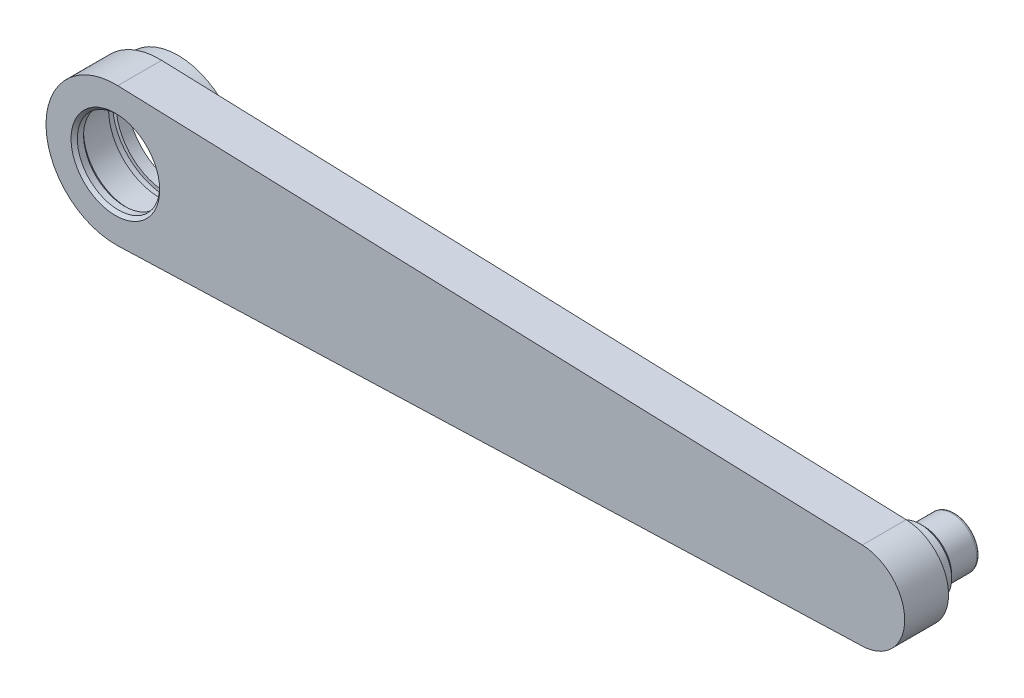
ISO-10303-21;
HEADER;
FILE_DESCRIPTION(('STEP AP214'),'2;1');
FILE_NAME('part.step','',(''),(''),'','','');
FILE_SCHEMA(('AUTOMOTIVE_DESIGN { 1 0 10303 214 1 1 1 1 }'));
ENDSEC;
DATA;
#1=APPLICATION_CONTEXT('core data for automotive mechanical design processes');
#2=APPLICATION_PROTOCOL_DEFINITION('international standard','automotive_design',2000,#1);
#3=PRODUCT_CONTEXT('',#1,'mechanical');
#4=PRODUCT('Part','Part','',(#3));
#5=PRODUCT_RELATED_PRODUCT_CATEGORY('part','',(#4));
#6=PRODUCT_DEFINITION_FORMATION('','',#4);
#7=PRODUCT_DEFINITION_CONTEXT('part definition',#1,'design');
#8=PRODUCT_DEFINITION('design','',#6,#7);
#9=PRODUCT_DEFINITION_SHAPE('','',#8);
#10=(LENGTH_UNIT() NAMED_UNIT(*) SI_UNIT(.MILLI.,.METRE.));
#11=(NAMED_UNIT(*) PLANE_ANGLE_UNIT() SI_UNIT($,.RADIAN.));
#12=(NAMED_UNIT(*) SI_UNIT($,.STERADIAN.) SOLID_ANGLE_UNIT());
#13=UNCERTAINTY_MEASURE_WITH_UNIT(LENGTH_MEASURE(1.E-05),#10,'distance_accuracy_value','');
#14=(GEOMETRIC_REPRESENTATION_CONTEXT(3) GLOBAL_UNCERTAINTY_ASSIGNED_CONTEXT((#13)) GLOBAL_UNIT_ASSIGNED_CONTEXT((#10,
#11,#12)) REPRESENTATION_CONTEXT('',''));
#15=CARTESIAN_POINT('',(0.,0.,0.));
#16=DIRECTION('',(0.,0.,1.));
#17=DIRECTION('',(1.,0.,0.));
#18=AXIS2_PLACEMENT_3D('',#15,#16,#17);
#19=CARTESIAN_POINT('',(0.,0.,7.));
#20=DIRECTION('',(0.,0.,-1.));
#21=DIRECTION('',(-1.,0.,0.));
#22=AXIS2_PLACEMENT_3D('',#19,#20,#21);
#23=CYLINDRICAL_SURFACE('',#22,8.075);
#24=CARTESIAN_POINT('',(0.,0.,-3.));
#25=DIRECTION('',(0.,0.,-1.));
#26=DIRECTION('',(-1.,0.,0.));
#27=AXIS2_PLACEMENT_3D('',#24,#25,#26);
#28=CIRCLE('',#27,8.075);
#29=CARTESIAN_POINT('',(-8.075,0.,-3.));
#30=VERTEX_POINT('',#29);
#31=EDGE_CURVE('E158',#30,#30,#28,.T.);
#32=ORIENTED_EDGE('',*,*,#31,.T.);
#33=EDGE_LOOP('',(#32));
#34=FACE_BOUND('',#33,.T.);
#35=CARTESIAN_POINT('',(0.,0.,-1.2));
#36=DIRECTION('',(0.,0.,1.));
#37=DIRECTION('',(1.,0.,0.));
#38=AXIS2_PLACEMENT_3D('',#35,#36,#37);
#39=CIRCLE('',#38,8.075);
#40=CARTESIAN_POINT('',(8.075,0.,-1.2));
#41=VERTEX_POINT('',#40);
#42=EDGE_CURVE('E51',#41,#41,#39,.T.);
#43=ORIENTED_EDGE('',*,*,#42,.T.);
#44=EDGE_LOOP('',(#43));
#45=FACE_BOUND('',#44,.T.);
#46=ADVANCED_FACE('F50',(#34,#45),#23,.F.);
#47=CARTESIAN_POINT('',(0.,0.,0.));
#48=DIRECTION('',(0.,0.,1.));
#49=DIRECTION('',(1.,0.,0.));
#50=AXIS2_PLACEMENT_3D('',#47,#48,#49);
#51=PLANE('',#50);
#52=DIRECTION('',(0.99941232754524,0.0342782664469186,0.));
#53=VECTOR('',#52,1.);
#54=CARTESIAN_POINT('',(0.379631800899624,-11.0684915275635,0.));
#55=LINE('',#54,#53);
#56=CARTESIAN_POINT('',(0.379631800899624,-11.0684915275635,0.));
#57=VERTEX_POINT('',#56);
#58=CARTESIAN_POINT('',(119.,-7.00000000000001,0.));
#59=VERTEX_POINT('',#58);
#60=EDGE_CURVE('E116',#57,#59,#55,.T.);
#61=ORIENTED_EDGE('',*,*,#60,.F.);
#62=CARTESIAN_POINT('',(0.,0.,0.));
#63=DIRECTION('',(0.,0.,1.));
#64=DIRECTION('',(1.,0.,0.));
#65=AXIS2_PLACEMENT_3D('',#62,#63,#64);
#66=CIRCLE('',#65,11.075);
#67=CARTESIAN_POINT('',(0.379248949579832,11.0685046521309,0.));
#68=VERTEX_POINT('',#67);
#69=EDGE_CURVE('E82',#68,#57,#66,.T.);
#70=ORIENTED_EDGE('',*,*,#69,.F.);
#71=DIRECTION('',(0.999413512607753,-0.0342436974789916,0.));
#72=VECTOR('',#71,1.);
#73=CARTESIAN_POINT('',(0.379248949579832,11.0685046521309,0.));
#74=LINE('',#73,#72);
#75=CARTESIAN_POINT('',(119.239705882353,6.99589458825428,0.));
#76=VERTEX_POINT('',#75);
#77=EDGE_CURVE('E122',#68,#76,#74,.T.);
#78=ORIENTED_EDGE('',*,*,#77,.T.);
#79=CARTESIAN_POINT('',(119.,0.,0.));
#80=DIRECTION('',(0.,0.,1.));
#81=DIRECTION('',(1.,0.,0.));
#82=AXIS2_PLACEMENT_3D('',#79,#80,#81);
#83=CIRCLE('',#82,7.00000000000001);
#84=EDGE_CURVE('E104',#59,#76,#83,.T.);
#85=ORIENTED_EDGE('',*,*,#84,.F.);
#86=EDGE_LOOP('',(#61,#70,#78,#85));
#87=FACE_BOUND('',#86,.T.);
#88=CARTESIAN_POINT('',(119.,0.,0.));
#89=DIRECTION('',(0.,0.,1.));
#90=DIRECTION('',(1.,0.,0.));
#91=AXIS2_PLACEMENT_3D('',#88,#89,#90);
#92=CIRCLE('',#91,5.);
#93=CARTESIAN_POINT('',(124.,0.,0.));
#94=VERTEX_POINT('',#93);
#95=EDGE_CURVE('E130',#94,#94,#92,.F.);
#96=ORIENTED_EDGE('',*,*,#95,.F.);
#97=EDGE_LOOP('',(#96));
#98=FACE_BOUND('',#97,.T.);
#99=CARTESIAN_POINT('',(0.,0.,0.));
#100=DIRECTION('',(0.,0.,1.));
#101=DIRECTION('',(1.,0.,0.));
#102=AXIS2_PLACEMENT_3D('',#99,#100,#101);
#103=CIRCLE('',#102,10.075);
#104=CARTESIAN_POINT('',(10.075,0.,0.));
#105=VERTEX_POINT('',#104);
#106=EDGE_CURVE('E11',#105,#105,#103,.F.);
#107=ORIENTED_EDGE('',*,*,#106,.F.);
#108=EDGE_LOOP('',(#107));
#109=FACE_BOUND('',#108,.T.);
#110=ADVANCED_FACE('F203',(#87,#98,#109),#51,.F.);
#111=CARTESIAN_POINT('',(119.,0.,-10.));
#112=DIRECTION('',(0.,0.,1.));
#113=DIRECTION('',(1.,0.,0.));
#114=AXIS2_PLACEMENT_3D('',#111,#112,#113);
#115=CYLINDRICAL_SURFACE('',#114,4.00000000000001);
#116=CARTESIAN_POINT('',(119.,0.,-7.5));
#117=DIRECTION('',(0.,0.,-1.));
#118=DIRECTION('',(-1.,0.,0.));
#119=AXIS2_PLACEMENT_3D('',#116,#117,#118);
#120=CIRCLE('',#119,4.00000000000001);
#121=CARTESIAN_POINT('',(115.,0.,-7.5));
#122=VERTEX_POINT('',#121);
#123=EDGE_CURVE('E60',#122,#122,#120,.F.);
#124=ORIENTED_EDGE('',*,*,#123,.T.);
#125=EDGE_LOOP('',(#124));
#126=FACE_BOUND('',#125,.T.);
#127=CARTESIAN_POINT('',(119.,0.,-3.));
#128=DIRECTION('',(0.,0.,-1.));
#129=DIRECTION('',(-1.,0.,0.));
#130=AXIS2_PLACEMENT_3D('',#127,#128,#129);
#131=CIRCLE('',#130,4.00000000000001);
#132=CARTESIAN_POINT('',(115.,0.,-3.));
#133=VERTEX_POINT('',#132);
#134=EDGE_CURVE('E176',#133,#133,#131,.T.);
#135=ORIENTED_EDGE('',*,*,#134,.T.);
#136=EDGE_LOOP('',(#135));
#137=FACE_BOUND('',#136,.T.);
#138=ADVANCED_FACE('F213',(#126,#137),#115,.T.);
#139=CARTESIAN_POINT('',(0.,0.,0.));
#140=DIRECTION('',(0.,0.,1.));
#141=DIRECTION('',(1.,0.,0.));
#142=AXIS2_PLACEMENT_3D('',#139,#140,#141);
#143=CIRCLE('',#142,8.075);
#144=CARTESIAN_POINT('',(8.075,0.,0.));
#145=VERTEX_POINT('',#144);
#146=EDGE_CURVE('E155',#145,#145,#143,.T.);
#147=ORIENTED_EDGE('',*,*,#146,.F.);
#148=EDGE_LOOP('',(#147));
#149=FACE_BOUND('',#148,.T.);
#150=CARTESIAN_POINT('',(0.,0.,5.));
#151=DIRECTION('',(0.,0.,1.));
#152=DIRECTION('',(1.,0.,0.));
#153=AXIS2_PLACEMENT_3D('',#150,#151,#152);
#154=CIRCLE('',#153,8.075);
#155=CARTESIAN_POINT('',(8.075,0.,5.));
#156=VERTEX_POINT('',#155);
#157=EDGE_CURVE('E118',#156,#156,#154,.T.);
#158=ORIENTED_EDGE('',*,*,#157,.T.);
#159=EDGE_LOOP('',(#158));
#160=FACE_BOUND('',#159,.T.);
#161=ADVANCED_FACE('F183',(#149,#160),#23,.F.);
#162=CARTESIAN_POINT('',(0.379631800899624,-11.0684915275635,7.));
#163=DIRECTION('',(-0.0342782664469186,0.99941232754524,0.));
#164=DIRECTION('',(-0.99941232754524,-0.0342782664469186,0.));
#165=AXIS2_PLACEMENT_3D('',#162,#163,#164);
#166=PLANE('',#165);
#167=ORIENTED_EDGE('',*,*,#60,.T.);
#168=DIRECTION('',(0.,0.,-1.));
#169=VECTOR('',#168,1.);
#170=CARTESIAN_POINT('',(119.,-7.00000000000001,7.));
#171=LINE('',#170,#169);
#172=CARTESIAN_POINT('',(119.,-7.00000000000001,7.));
#173=VERTEX_POINT('',#172);
#174=EDGE_CURVE('E108',#173,#59,#171,.T.);
#175=ORIENTED_EDGE('',*,*,#174,.F.);
#176=DIRECTION('',(0.99941232754524,0.0342782664469186,0.));
#177=VECTOR('',#176,1.);
#178=CARTESIAN_POINT('',(0.379631800899624,-11.0684915275635,7.));
#179=LINE('',#178,#177);
#180=CARTESIAN_POINT('',(0.379631800899624,-11.0684915275635,7.));
#181=VERTEX_POINT('',#180);
#182=EDGE_CURVE('E96',#181,#173,#179,.T.);
#183=ORIENTED_EDGE('',*,*,#182,.F.);
#184=DIRECTION('',(0.,0.,-1.));
#185=VECTOR('',#184,1.);
#186=CARTESIAN_POINT('',(0.379631800899624,-11.0684915275635,7.));
#187=LINE('',#186,#185);
#188=EDGE_CURVE('E115',#181,#57,#187,.T.);
#189=ORIENTED_EDGE('',*,*,#188,.T.);
#190=EDGE_LOOP('',(#167,#175,#183,#189));
#191=FACE_BOUND('',#190,.T.);
#192=ADVANCED_FACE('F218',(#191),#166,.F.);
#193=CARTESIAN_POINT('',(119.,0.,7.));
#194=DIRECTION('',(0.,0.,-1.));
#195=DIRECTION('',(-1.,0.,0.));
#196=AXIS2_PLACEMENT_3D('',#193,#194,#195);
#197=CYLINDRICAL_SURFACE('',#196,7.00000000000001);
#198=ORIENTED_EDGE('',*,*,#84,.T.);
#199=DIRECTION('',(0.,0.,-1.));
#200=VECTOR('',#199,1.);
#201=CARTESIAN_POINT('',(119.239705882353,6.99589458825428,7.));
#202=LINE('',#201,#200);
#203=CARTESIAN_POINT('',(119.239705882353,6.99589458825428,7.));
#204=VERTEX_POINT('',#203);
#205=EDGE_CURVE('E105',#204,#76,#202,.T.);
#206=ORIENTED_EDGE('',*,*,#205,.F.);
#207=CARTESIAN_POINT('',(119.,0.,7.));
#208=DIRECTION('',(0.,0.,1.));
#209=DIRECTION('',(1.,0.,0.));
#210=AXIS2_PLACEMENT_3D('',#207,#208,#209);
#211=CIRCLE('',#210,7.00000000000001);
#212=EDGE_CURVE('E93',#173,#204,#211,.T.);
#213=ORIENTED_EDGE('',*,*,#212,.F.);
#214=ORIENTED_EDGE('',*,*,#174,.T.);
#215=EDGE_LOOP('',(#198,#206,#213,#214));
#216=FACE_BOUND('',#215,.T.);
#217=ADVANCED_FACE('F101',(#216),#197,.T.);
#218=CARTESIAN_POINT('',(0.379248949579832,11.0685046521309,7.));
#219=DIRECTION('',(0.0342436974789916,0.999413512607753,0.));
#220=DIRECTION('',(-0.999413512607753,0.0342436974789916,0.));
#221=AXIS2_PLACEMENT_3D('',#218,#219,#220);
#222=PLANE('',#221);
#223=ORIENTED_EDGE('',*,*,#77,.F.);
#224=DIRECTION('',(0.,0.,-1.));
#225=VECTOR('',#224,1.);
#226=CARTESIAN_POINT('',(0.379248949579832,11.0685046521309,7.));
#227=LINE('',#226,#225);
#228=CARTESIAN_POINT('',(0.379248949579832,11.0685046521309,7.));
#229=VERTEX_POINT('',#228);
#230=EDGE_CURVE('E85',#229,#68,#227,.T.);
#231=ORIENTED_EDGE('',*,*,#230,.F.);
#232=DIRECTION('',(0.999413512607753,-0.0342436974789916,0.));
#233=VECTOR('',#232,1.);
#234=CARTESIAN_POINT('',(0.379248949579832,11.0685046521309,7.));
#235=LINE('',#234,#233);
#236=EDGE_CURVE('E98',#229,#204,#235,.T.);
#237=ORIENTED_EDGE('',*,*,#236,.T.);
#238=ORIENTED_EDGE('',*,*,#205,.T.);
#239=EDGE_LOOP('',(#223,#231,#237,#238));
#240=FACE_BOUND('',#239,.T.);
#241=ADVANCED_FACE('F109',(#240),#222,.T.);
#242=CARTESIAN_POINT('',(0.,0.,7.));
#243=DIRECTION('',(0.,0.,-1.));
#244=DIRECTION('',(-1.,0.,0.));
#245=AXIS2_PLACEMENT_3D('',#242,#243,#244);
#246=CYLINDRICAL_SURFACE('',#245,11.075);
#247=ORIENTED_EDGE('',*,*,#69,.T.);
#248=ORIENTED_EDGE('',*,*,#188,.F.);
#249=CARTESIAN_POINT('',(0.,0.,7.));
#250=DIRECTION('',(0.,0.,1.));
#251=DIRECTION('',(1.,0.,0.));
#252=AXIS2_PLACEMENT_3D('',#249,#250,#251);
#253=CIRCLE('',#252,11.075);
#254=EDGE_CURVE('E68',#229,#181,#253,.T.);
#255=ORIENTED_EDGE('',*,*,#254,.F.);
#256=ORIENTED_EDGE('',*,*,#230,.T.);
#257=EDGE_LOOP('',(#247,#248,#255,#256));
#258=FACE_BOUND('',#257,.T.);
#259=ADVANCED_FACE('F197',(#258),#246,.T.);
#260=CARTESIAN_POINT('',(0.,0.,7.));
#261=DIRECTION('',(0.,0.,1.));
#262=DIRECTION('',(1.,0.,0.));
#263=AXIS2_PLACEMENT_3D('',#260,#261,#262);
#264=PLANE('',#263);
#265=CARTESIAN_POINT('',(0.,0.,7.));
#266=DIRECTION('',(0.,0.,1.));
#267=DIRECTION('',(1.,0.,0.));
#268=AXIS2_PLACEMENT_3D('',#265,#266,#267);
#269=CIRCLE('',#268,7.07500000000001);
#270=CARTESIAN_POINT('',(7.07500000000001,0.,7.));
#271=VERTEX_POINT('',#270);
#272=EDGE_CURVE('E137',#271,#271,#269,.F.);
#273=ORIENTED_EDGE('',*,*,#272,.T.);
#274=EDGE_LOOP('',(#273));
#275=FACE_BOUND('',#274,.T.);
#276=ORIENTED_EDGE('',*,*,#182,.T.);
#277=ORIENTED_EDGE('',*,*,#212,.T.);
#278=ORIENTED_EDGE('',*,*,#236,.F.);
#279=ORIENTED_EDGE('',*,*,#254,.T.);
#280=EDGE_LOOP('',(#276,#277,#278,#279));
#281=FACE_BOUND('',#280,.T.);
#282=ADVANCED_FACE('F94',(#275,#281),#264,.T.);
#283=CARTESIAN_POINT('',(0.,0.,5.));
#284=DIRECTION('',(0.,0.,1.));
#285=DIRECTION('',(1.,0.,0.));
#286=AXIS2_PLACEMENT_3D('',#283,#284,#285);
#287=PLANE('',#286);
#288=CARTESIAN_POINT('',(0.,0.,5.));
#289=DIRECTION('',(0.,0.,1.));
#290=DIRECTION('',(1.,0.,0.));
#291=AXIS2_PLACEMENT_3D('',#288,#289,#290);
#292=CIRCLE('',#291,7.07500000000001);
#293=CARTESIAN_POINT('',(7.07500000000001,0.,5.));
#294=VERTEX_POINT('',#293);
#295=EDGE_CURVE('E139',#294,#294,#292,.T.);
#296=ORIENTED_EDGE('',*,*,#295,.T.);
#297=EDGE_LOOP('',(#296));
#298=FACE_BOUND('',#297,.T.);
#299=ORIENTED_EDGE('',*,*,#157,.F.);
#300=EDGE_LOOP('',(#299));
#301=FACE_BOUND('',#300,.T.);
#302=ADVANCED_FACE('F187',(#298,#301),#287,.F.);
#303=CARTESIAN_POINT('',(0.,0.,5.));
#304=DIRECTION('',(0.,0.,1.));
#305=DIRECTION('',(1.,0.,0.));
#306=AXIS2_PLACEMENT_3D('',#303,#304,#305);
#307=CYLINDRICAL_SURFACE('',#306,6.575);
#308=CARTESIAN_POINT('',(0.,0.,6.49999999999998));
#309=DIRECTION('',(0.,0.,1.));
#310=DIRECTION('',(1.,0.,0.));
#311=AXIS2_PLACEMENT_3D('',#308,#309,#310);
#312=CIRCLE('',#311,6.575);
#313=CARTESIAN_POINT('',(6.575,0.,6.49999999999998));
#314=VERTEX_POINT('',#313);
#315=EDGE_CURVE('E131',#314,#314,#312,.T.);
#316=ORIENTED_EDGE('',*,*,#315,.T.);
#317=EDGE_LOOP('',(#316));
#318=FACE_BOUND('',#317,.T.);
#319=CARTESIAN_POINT('',(0.,0.,5.50000000000002));
#320=DIRECTION('',(0.,0.,1.));
#321=DIRECTION('',(1.,0.,0.));
#322=AXIS2_PLACEMENT_3D('',#319,#320,#321);
#323=CIRCLE('',#322,6.575);
#324=CARTESIAN_POINT('',(6.575,0.,5.50000000000002));
#325=VERTEX_POINT('',#324);
#326=EDGE_CURVE('E127',#325,#325,#323,.F.);
#327=ORIENTED_EDGE('',*,*,#326,.T.);
#328=EDGE_LOOP('',(#327));
#329=FACE_BOUND('',#328,.T.);
#330=ADVANCED_FACE('F189',(#318,#329),#307,.F.);
#331=CARTESIAN_POINT('',(119.,0.,-3.));
#332=DIRECTION('',(0.,0.,-1.));
#333=DIRECTION('',(-1.,0.,0.));
#334=AXIS2_PLACEMENT_3D('',#331,#332,#333);
#335=PLANE('',#334);
#336=CARTESIAN_POINT('',(119.,0.,-3.));
#337=DIRECTION('',(0.,0.,-1.));
#338=DIRECTION('',(-1.,0.,0.));
#339=AXIS2_PLACEMENT_3D('',#336,#337,#338);
#340=CIRCLE('',#339,4.5);
#341=CARTESIAN_POINT('',(114.5,0.,-3.));
#342=VERTEX_POINT('',#341);
#343=EDGE_CURVE('E145',#342,#342,#340,.T.);
#344=ORIENTED_EDGE('',*,*,#343,.T.);
#345=EDGE_LOOP('',(#344));
#346=FACE_BOUND('',#345,.T.);
#347=ORIENTED_EDGE('',*,*,#134,.F.);
#348=EDGE_LOOP('',(#347));
#349=FACE_BOUND('',#348,.T.);
#350=ADVANCED_FACE('F192',(#346,#349),#335,.T.);
#351=CARTESIAN_POINT('',(119.,0.,-3.));
#352=DIRECTION('',(0.,0.,1.));
#353=DIRECTION('',(1.,0.,0.));
#354=AXIS2_PLACEMENT_3D('',#351,#352,#353);
#355=CYLINDRICAL_SURFACE('',#354,5.);
#356=CARTESIAN_POINT('',(119.,0.,-2.50000000000002));
#357=DIRECTION('',(0.,0.,-1.));
#358=DIRECTION('',(-1.,0.,0.));
#359=AXIS2_PLACEMENT_3D('',#356,#357,#358);
#360=CIRCLE('',#359,5.);
#361=CARTESIAN_POINT('',(114.,0.,-2.50000000000002));
#362=VERTEX_POINT('',#361);
#363=EDGE_CURVE('E143',#362,#362,#360,.F.);
#364=ORIENTED_EDGE('',*,*,#363,.T.);
#365=EDGE_LOOP('',(#364));
#366=FACE_BOUND('',#365,.T.);
#367=ORIENTED_EDGE('',*,*,#95,.T.);
#368=EDGE_LOOP('',(#367));
#369=FACE_BOUND('',#368,.T.);
#370=ADVANCED_FACE('F231',(#366,#369),#355,.T.);
#371=CARTESIAN_POINT('',(0.,0.,6.49999999999998));
#372=DIRECTION('',(0.,0.,1.));
#373=DIRECTION('',(1.,0.,0.));
#374=AXIS2_PLACEMENT_3D('',#371,#372,#373);
#375=CONICAL_SURFACE('',#374,6.575,0.78539816339744);
#376=ORIENTED_EDGE('',*,*,#272,.F.);
#377=EDGE_LOOP('',(#376));
#378=FACE_BOUND('',#377,.T.);
#379=ORIENTED_EDGE('',*,*,#315,.F.);
#380=EDGE_LOOP('',(#379));
#381=FACE_BOUND('',#380,.T.);
#382=ADVANCED_FACE('F236',(#378,#381),#375,.F.);
#383=CARTESIAN_POINT('',(0.,0.,5.));
#384=DIRECTION('',(0.,0.,-1.));
#385=DIRECTION('',(-1.,0.,0.));
#386=AXIS2_PLACEMENT_3D('',#383,#384,#385);
#387=CONICAL_SURFACE('',#386,7.07500000000001,0.785398163397444);
#388=ORIENTED_EDGE('',*,*,#326,.F.);
#389=EDGE_LOOP('',(#388));
#390=FACE_BOUND('',#389,.T.);
#391=ORIENTED_EDGE('',*,*,#295,.F.);
#392=EDGE_LOOP('',(#391));
#393=FACE_BOUND('',#392,.T.);
#394=ADVANCED_FACE('F360',(#390,#393),#387,.F.);
#395=CARTESIAN_POINT('',(119.,0.,-3.));
#396=DIRECTION('',(0.,0.,1.));
#397=DIRECTION('',(1.,0.,0.));
#398=AXIS2_PLACEMENT_3D('',#395,#396,#397);
#399=CONICAL_SURFACE('',#398,4.5,0.785398163397466);
#400=ORIENTED_EDGE('',*,*,#363,.F.);
#401=EDGE_LOOP('',(#400));
#402=FACE_BOUND('',#401,.T.);
#403=ORIENTED_EDGE('',*,*,#343,.F.);
#404=EDGE_LOOP('',(#403));
#405=FACE_BOUND('',#404,.T.);
#406=ADVANCED_FACE('F242',(#402,#405),#399,.T.);
#407=CARTESIAN_POINT('',(119.,0.,-8.));
#408=DIRECTION('',(0.,0.,-1.));
#409=DIRECTION('',(-1.,0.,0.));
#410=AXIS2_PLACEMENT_3D('',#407,#408,#409);
#411=PLANE('',#410);
#412=CARTESIAN_POINT('',(119.,0.,-8.));
#413=DIRECTION('',(0.,0.,-1.));
#414=DIRECTION('',(-1.,0.,0.));
#415=AXIS2_PLACEMENT_3D('',#412,#413,#414);
#416=CIRCLE('',#415,2.2);
#417=CARTESIAN_POINT('',(116.8,0.,-8.));
#418=VERTEX_POINT('',#417);
#419=EDGE_CURVE('E175',#418,#418,#416,.T.);
#420=ORIENTED_EDGE('',*,*,#419,.F.);
#421=EDGE_LOOP('',(#420));
#422=FACE_BOUND('',#421,.T.);
#423=CARTESIAN_POINT('',(119.,0.,-8.));
#424=DIRECTION('',(0.,0.,-1.));
#425=DIRECTION('',(-1.,0.,0.));
#426=AXIS2_PLACEMENT_3D('',#423,#424,#425);
#427=CIRCLE('',#426,3.50000000000001);
#428=CARTESIAN_POINT('',(115.5,0.,-8.));
#429=VERTEX_POINT('',#428);
#430=EDGE_CURVE('E146',#429,#429,#427,.T.);
#431=ORIENTED_EDGE('',*,*,#430,.T.);
#432=EDGE_LOOP('',(#431));
#433=FACE_BOUND('',#432,.T.);
#434=ADVANCED_FACE('F241',(#422,#433),#411,.T.);
#435=CARTESIAN_POINT('',(119.,0.,-7.5));
#436=DIRECTION('',(0.,0.,-1.));
#437=DIRECTION('',(-1.,0.,0.));
#438=AXIS2_PLACEMENT_3D('',#435,#436,#437);
#439=TOROIDAL_SURFACE('',#438,3.50000000000001,0.5);
#440=ORIENTED_EDGE('',*,*,#123,.F.);
#441=EDGE_LOOP('',(#440));
#442=FACE_BOUND('',#441,.T.);
#443=ORIENTED_EDGE('',*,*,#430,.F.);
#444=EDGE_LOOP('',(#443));
#445=FACE_BOUND('',#444,.T.);
#446=ADVANCED_FACE('F47',(#442,#445),#439,.T.);
#447=CARTESIAN_POINT('',(119.,0.,2.));
#448=DIRECTION('',(0.,0.,-1.));
#449=DIRECTION('',(-1.,0.,0.));
#450=AXIS2_PLACEMENT_3D('',#447,#448,#449);
#451=CYLINDRICAL_SURFACE('',#450,2.2);
#452=CARTESIAN_POINT('',(119.,0.,2.));
#453=DIRECTION('',(0.,0.,-1.));
#454=DIRECTION('',(-1.,0.,0.));
#455=AXIS2_PLACEMENT_3D('',#452,#453,#454);
#456=CIRCLE('',#455,2.2);
#457=CARTESIAN_POINT('',(116.8,0.,2.));
#458=VERTEX_POINT('',#457);
#459=EDGE_CURVE('E173',#458,#458,#456,.T.);
#460=ORIENTED_EDGE('',*,*,#459,.F.);
#461=EDGE_LOOP('',(#460));
#462=FACE_BOUND('',#461,.T.);
#463=ORIENTED_EDGE('',*,*,#419,.T.);
#464=EDGE_LOOP('',(#463));
#465=FACE_BOUND('',#464,.T.);
#466=ADVANCED_FACE('F246',(#462,#465),#451,.F.);
#467=CARTESIAN_POINT('',(119.,0.,2.));
#468=DIRECTION('',(0.,0.,-1.));
#469=DIRECTION('',(-1.,0.,0.));
#470=AXIS2_PLACEMENT_3D('',#467,#468,#469);
#471=PLANE('',#470);
#472=ORIENTED_EDGE('',*,*,#459,.T.);
#473=EDGE_LOOP('',(#472));
#474=FACE_BOUND('',#473,.T.);
#475=ADVANCED_FACE('F248',(#474),#471,.T.);
#476=CARTESIAN_POINT('',(0.,0.,-3.));
#477=DIRECTION('',(0.,0.,-1.));
#478=DIRECTION('',(-1.,0.,0.));
#479=AXIS2_PLACEMENT_3D('',#476,#477,#478);
#480=PLANE('',#479);
#481=CARTESIAN_POINT('',(0.,0.,-3.));
#482=DIRECTION('',(0.,0.,-1.));
#483=DIRECTION('',(-1.,0.,0.));
#484=AXIS2_PLACEMENT_3D('',#481,#482,#483);
#485=CIRCLE('',#484,10.075);
#486=CARTESIAN_POINT('',(-10.075,0.,-3.));
#487=VERTEX_POINT('',#486);
#488=EDGE_CURVE('E169',#487,#487,#485,.T.);
#489=ORIENTED_EDGE('',*,*,#488,.T.);
#490=EDGE_LOOP('',(#489));
#491=FACE_BOUND('',#490,.T.);
#492=ORIENTED_EDGE('',*,*,#31,.F.);
#493=EDGE_LOOP('',(#492));
#494=FACE_BOUND('',#493,.T.);
#495=ADVANCED_FACE('F254',(#491,#494),#480,.T.);
#496=CARTESIAN_POINT('',(0.,0.,-3.));
#497=DIRECTION('',(0.,0.,1.));
#498=DIRECTION('',(1.,0.,0.));
#499=AXIS2_PLACEMENT_3D('',#496,#497,#498);
#500=CYLINDRICAL_SURFACE('',#499,10.075);
#501=ORIENTED_EDGE('',*,*,#488,.F.);
#502=EDGE_LOOP('',(#501));
#503=FACE_BOUND('',#502,.T.);
#504=ORIENTED_EDGE('',*,*,#106,.T.);
#505=EDGE_LOOP('',(#504));
#506=FACE_BOUND('',#505,.T.);
#507=ADVANCED_FACE('F253',(#503,#506),#500,.T.);
#508=CARTESIAN_POINT('',(0.,0.,0.));
#509=DIRECTION('',(0.,0.,1.));
#510=DIRECTION('',(1.,0.,0.));
#511=AXIS2_PLACEMENT_3D('',#508,#509,#510);
#512=CYLINDRICAL_SURFACE('',#511,8.65);
#513=CARTESIAN_POINT('',(0.,0.,0.));
#514=DIRECTION('',(0.,0.,1.));
#515=DIRECTION('',(1.,0.,0.));
#516=AXIS2_PLACEMENT_3D('',#513,#514,#515);
#517=CIRCLE('',#516,8.65);
#518=CARTESIAN_POINT('',(8.65,0.,0.));
#519=VERTEX_POINT('',#518);
#520=EDGE_CURVE('E156',#519,#519,#517,.T.);
#521=ORIENTED_EDGE('',*,*,#520,.T.);
#522=EDGE_LOOP('',(#521));
#523=FACE_BOUND('',#522,.T.);
#524=CARTESIAN_POINT('',(0.,0.,-1.2));
#525=DIRECTION('',(0.,0.,1.));
#526=DIRECTION('',(1.,0.,0.));
#527=AXIS2_PLACEMENT_3D('',#524,#525,#526);
#528=CIRCLE('',#527,8.65);
#529=CARTESIAN_POINT('',(8.65,0.,-1.2));
#530=VERTEX_POINT('',#529);
#531=EDGE_CURVE('E152',#530,#530,#528,.T.);
#532=ORIENTED_EDGE('',*,*,#531,.F.);
#533=EDGE_LOOP('',(#532));
#534=FACE_BOUND('',#533,.T.);
#535=ADVANCED_FACE('F260',(#523,#534),#512,.F.);
#536=CARTESIAN_POINT('',(0.,0.,-1.2));
#537=DIRECTION('',(0.,0.,1.));
#538=DIRECTION('',(1.,0.,0.));
#539=AXIS2_PLACEMENT_3D('',#536,#537,#538);
#540=PLANE('',#539);
#541=ORIENTED_EDGE('',*,*,#42,.F.);
#542=EDGE_LOOP('',(#541));
#543=FACE_BOUND('',#542,.T.);
#544=ORIENTED_EDGE('',*,*,#531,.T.);
#545=EDGE_LOOP('',(#544));
#546=FACE_BOUND('',#545,.T.);
#547=ADVANCED_FACE('F261',(#543,#546),#540,.T.);
#548=CARTESIAN_POINT('',(0.,0.,0.));
#549=DIRECTION('',(0.,0.,1.));
#550=DIRECTION('',(1.,0.,0.));
#551=AXIS2_PLACEMENT_3D('',#548,#549,#550);
#552=PLANE('',#551);
#553=ORIENTED_EDGE('',*,*,#146,.T.);
#554=EDGE_LOOP('',(#553));
#555=FACE_BOUND('',#554,.T.);
#556=ORIENTED_EDGE('',*,*,#520,.F.);
#557=EDGE_LOOP('',(#556));
#558=FACE_BOUND('',#557,.T.);
#559=ADVANCED_FACE('F270',(#555,#558),#552,.F.);
#560=CLOSED_SHELL('',(#46,#110,#138,#161,#192,#217,#241,#259,#282,#302,#330,#350,#370,#382,#394,
#406,#434,#446,#466,#475,#495,#507,#535,#547,#559));
#561=MANIFOLD_SOLID_BREP('B2',#560);
#562=ADVANCED_BREP_SHAPE_REPRESENTATION('',(#18,#561),#14);
#563=SHAPE_DEFINITION_REPRESENTATION(#9,#562);
ENDSEC;
END-ISO-10303-21;
